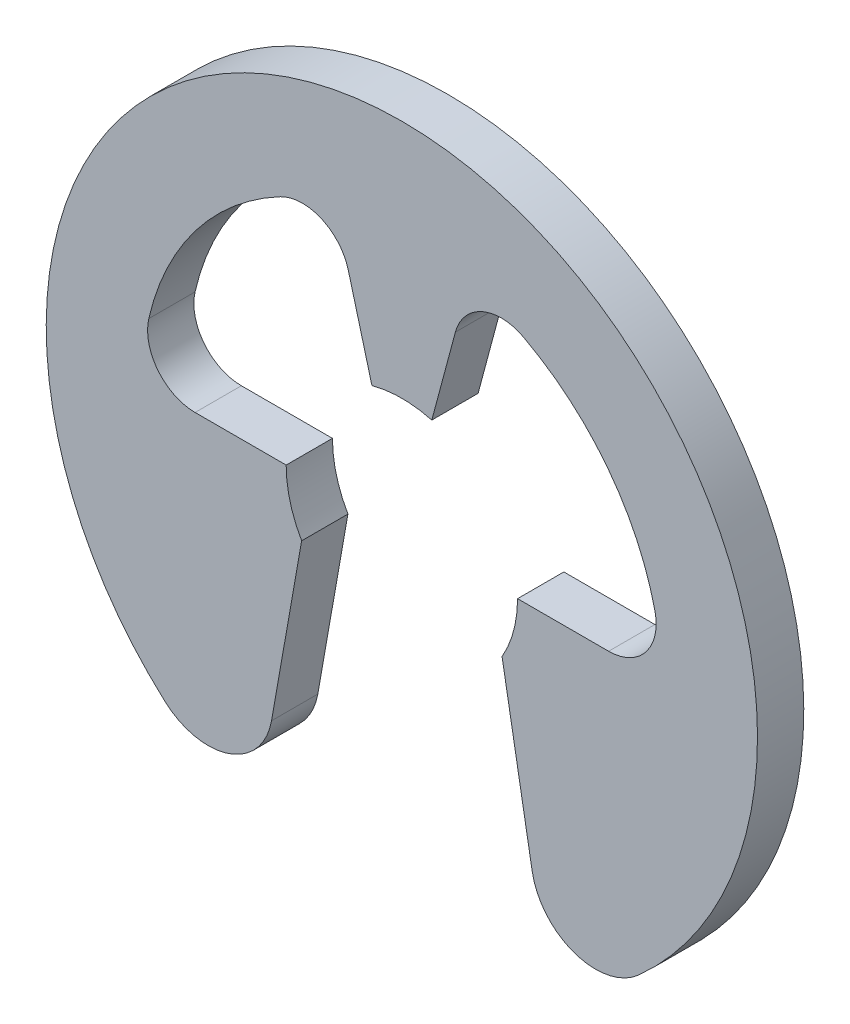
ISO-10303-21;
HEADER;
FILE_DESCRIPTION(('STEP AP214'),'2;1');
FILE_NAME('part.step','',(''),(''),'','','');
FILE_SCHEMA(('AUTOMOTIVE_DESIGN { 1 0 10303 214 1 1 1 1 }'));
ENDSEC;
DATA;
#1=APPLICATION_CONTEXT('core data for automotive mechanical design processes');
#2=APPLICATION_PROTOCOL_DEFINITION('international standard','automotive_design',2000,#1);
#3=PRODUCT_CONTEXT('',#1,'mechanical');
#4=PRODUCT('Part','Part','',(#3));
#5=PRODUCT_RELATED_PRODUCT_CATEGORY('part','',(#4));
#6=PRODUCT_DEFINITION_FORMATION('','',#4);
#7=PRODUCT_DEFINITION_CONTEXT('part definition',#1,'design');
#8=PRODUCT_DEFINITION('design','',#6,#7);
#9=PRODUCT_DEFINITION_SHAPE('','',#8);
#10=(LENGTH_UNIT() NAMED_UNIT(*) SI_UNIT(.MILLI.,.METRE.));
#11=(NAMED_UNIT(*) PLANE_ANGLE_UNIT() SI_UNIT($,.RADIAN.));
#12=(NAMED_UNIT(*) SI_UNIT($,.STERADIAN.) SOLID_ANGLE_UNIT());
#13=UNCERTAINTY_MEASURE_WITH_UNIT(LENGTH_MEASURE(1.E-05),#10,'distance_accuracy_value','');
#14=(GEOMETRIC_REPRESENTATION_CONTEXT(3) GLOBAL_UNCERTAINTY_ASSIGNED_CONTEXT((#13)) GLOBAL_UNIT_ASSIGNED_CONTEXT((#10,
#11,#12)) REPRESENTATION_CONTEXT('',''));
#15=CARTESIAN_POINT('',(0.,0.,0.));
#16=DIRECTION('',(0.,0.,1.));
#17=DIRECTION('',(1.,0.,0.));
#18=AXIS2_PLACEMENT_3D('',#15,#16,#17);
#19=CARTESIAN_POINT('',(2.83700757418314,0.651837909836066,-0.635));
#20=DIRECTION('',(0.,0.,1.));
#21=DIRECTION('',(1.,0.,0.));
#22=AXIS2_PLACEMENT_3D('',#19,#20,#21);
#23=CYLINDRICAL_SURFACE('',#22,0.651837909836066);
#24=CARTESIAN_POINT('',(2.83700757418314,0.651837909836066,0.));
#25=DIRECTION('',(0.,0.,-1.));
#26=DIRECTION('',(1.,0.,0.));
#27=AXIS2_PLACEMENT_3D('',#24,#25,#26);
#28=CIRCLE('',#27,0.651837909836066);
#29=CARTESIAN_POINT('',(3.47229253489555,0.797802561009159,0.));
#30=VERTEX_POINT('',#29);
#31=CARTESIAN_POINT('',(2.83700757418314,0.,0.));
#32=VERTEX_POINT('',#31);
#33=EDGE_CURVE('E188',#30,#32,#28,.T.);
#34=ORIENTED_EDGE('',*,*,#33,.F.);
#35=DIRECTION('',(0.,0.,1.));
#36=VECTOR('',#35,1.);
#37=CARTESIAN_POINT('',(3.47229253489555,0.797802561009159,-0.635));
#38=LINE('',#37,#36);
#39=CARTESIAN_POINT('',(3.47229253489555,0.797802561009159,-0.635));
#40=VERTEX_POINT('',#39);
#41=EDGE_CURVE('E11',#40,#30,#38,.T.);
#42=ORIENTED_EDGE('',*,*,#41,.F.);
#43=CARTESIAN_POINT('',(2.83700757418314,0.651837909836066,-0.635));
#44=DIRECTION('',(0.,0.,-1.));
#45=DIRECTION('',(1.,0.,0.));
#46=AXIS2_PLACEMENT_3D('',#43,#44,#45);
#47=CIRCLE('',#46,0.651837909836066);
#48=CARTESIAN_POINT('',(2.83700757418314,0.,-0.635));
#49=VERTEX_POINT('',#48);
#50=EDGE_CURVE('E238',#40,#49,#47,.T.);
#51=ORIENTED_EDGE('',*,*,#50,.T.);
#52=DIRECTION('',(0.,0.,1.));
#53=VECTOR('',#52,1.);
#54=CARTESIAN_POINT('',(2.83700757418314,0.,-0.635));
#55=LINE('',#54,#53);
#56=EDGE_CURVE('E34',#49,#32,#55,.T.);
#57=ORIENTED_EDGE('',*,*,#56,.T.);
#58=EDGE_LOOP('',(#34,#42,#51,#57));
#59=FACE_BOUND('',#58,.T.);
#60=ADVANCED_FACE('F31',(#59),#23,.F.);
#61=CARTESIAN_POINT('',(0.,0.,-0.635));
#62=DIRECTION('',(0.,0.,1.));
#63=DIRECTION('',(1.,0.,0.));
#64=AXIS2_PLACEMENT_3D('',#61,#62,#63);
#65=CYLINDRICAL_SURFACE('',#64,3.56276639344262);
#66=CARTESIAN_POINT('',(0.,0.,0.));
#67=DIRECTION('',(0.,0.,-1.));
#68=DIRECTION('',(1.,0.,0.));
#69=AXIS2_PLACEMENT_3D('',#66,#67,#68);
#70=CIRCLE('',#69,3.56276639344262);
#71=CARTESIAN_POINT('',(1.66931353615659,3.14749053886561,0.));
#72=VERTEX_POINT('',#71);
#73=EDGE_CURVE('E236',#72,#30,#70,.T.);
#74=ORIENTED_EDGE('',*,*,#73,.F.);
#75=DIRECTION('',(0.,0.,1.));
#76=VECTOR('',#75,1.);
#77=CARTESIAN_POINT('',(1.66931353615659,3.14749053886561,-0.635));
#78=LINE('',#77,#76);
#79=CARTESIAN_POINT('',(1.66931353615659,3.14749053886561,-0.635));
#80=VERTEX_POINT('',#79);
#81=EDGE_CURVE('E40',#80,#72,#78,.T.);
#82=ORIENTED_EDGE('',*,*,#81,.F.);
#83=CARTESIAN_POINT('',(0.,0.,-0.635));
#84=DIRECTION('',(0.,0.,-1.));
#85=DIRECTION('',(1.,0.,0.));
#86=AXIS2_PLACEMENT_3D('',#83,#84,#85);
#87=CIRCLE('',#86,3.56276639344262);
#88=EDGE_CURVE('E178',#80,#40,#87,.T.);
#89=ORIENTED_EDGE('',*,*,#88,.T.);
#90=ORIENTED_EDGE('',*,*,#41,.T.);
#91=EDGE_LOOP('',(#74,#82,#89,#90));
#92=FACE_BOUND('',#91,.T.);
#93=ADVANCED_FACE('F270',(#92),#65,.F.);
#94=CARTESIAN_POINT('',(1.36389866296364,2.5716308198958,-0.635));
#95=DIRECTION('',(0.,0.,1.));
#96=DIRECTION('',(1.,0.,0.));
#97=AXIS2_PLACEMENT_3D('',#94,#95,#96);
#98=CYLINDRICAL_SURFACE('',#97,0.651837909836066);
#99=CARTESIAN_POINT('',(1.36389866296364,2.5716308198958,0.));
#100=DIRECTION('',(0.,0.,-1.));
#101=DIRECTION('',(1.,0.,0.));
#102=AXIS2_PLACEMENT_3D('',#99,#100,#101);
#103=CIRCLE('',#102,0.651837909836066);
#104=CARTESIAN_POINT('',(0.734271591298702,2.7403388852812,0.));
#105=VERTEX_POINT('',#104);
#106=EDGE_CURVE('E165',#105,#72,#103,.T.);
#107=ORIENTED_EDGE('',*,*,#106,.F.);
#108=DIRECTION('',(0.,0.,1.));
#109=VECTOR('',#108,1.);
#110=CARTESIAN_POINT('',(0.734271591298702,2.7403388852812,-0.635));
#111=LINE('',#110,#109);
#112=CARTESIAN_POINT('',(0.734271591298702,2.7403388852812,-0.635));
#113=VERTEX_POINT('',#112);
#114=EDGE_CURVE('E160',#113,#105,#111,.T.);
#115=ORIENTED_EDGE('',*,*,#114,.F.);
#116=CARTESIAN_POINT('',(1.36389866296364,2.5716308198958,-0.635));
#117=DIRECTION('',(0.,0.,-1.));
#118=DIRECTION('',(1.,0.,0.));
#119=AXIS2_PLACEMENT_3D('',#116,#117,#118);
#120=CIRCLE('',#119,0.651837909836066);
#121=EDGE_CURVE('E163',#113,#80,#120,.T.);
#122=ORIENTED_EDGE('',*,*,#121,.T.);
#123=ORIENTED_EDGE('',*,*,#81,.T.);
#124=EDGE_LOOP('',(#107,#115,#122,#123));
#125=FACE_BOUND('',#124,.T.);
#126=ADVANCED_FACE('F162',(#125),#98,.F.);
#127=CARTESIAN_POINT('',(0.410875234100253,1.5334072492339,-0.635));
#128=DIRECTION('',(0.965925826289068,-0.258819045102522,0.));
#129=DIRECTION('',(0.258819045102522,0.965925826289068,0.));
#130=AXIS2_PLACEMENT_3D('',#127,#128,#129);
#131=PLANE('',#130);
#132=DIRECTION('',(0.258819045102522,0.965925826289068,0.));
#133=VECTOR('',#132,1.);
#134=CARTESIAN_POINT('',(0.410875234100253,1.5334072492339,0.));
#135=LINE('',#134,#133);
#136=CARTESIAN_POINT('',(0.410875234100253,1.5334072492339,0.));
#137=VERTEX_POINT('',#136);
#138=EDGE_CURVE('E233',#137,#105,#135,.T.);
#139=ORIENTED_EDGE('',*,*,#138,.F.);
#140=DIRECTION('',(0.,0.,1.));
#141=VECTOR('',#140,1.);
#142=CARTESIAN_POINT('',(0.410875234100253,1.5334072492339,-0.635));
#143=LINE('',#142,#141);
#144=CARTESIAN_POINT('',(0.410875234100253,1.5334072492339,-0.635));
#145=VERTEX_POINT('',#144);
#146=EDGE_CURVE('E170',#145,#137,#143,.T.);
#147=ORIENTED_EDGE('',*,*,#146,.F.);
#148=DIRECTION('',(0.258819045102522,0.965925826289068,0.));
#149=VECTOR('',#148,1.);
#150=CARTESIAN_POINT('',(0.410875234100253,1.5334072492339,-0.635));
#151=LINE('',#150,#149);
#152=EDGE_CURVE('E176',#145,#113,#151,.T.);
#153=ORIENTED_EDGE('',*,*,#152,.T.);
#154=ORIENTED_EDGE('',*,*,#114,.T.);
#155=EDGE_LOOP('',(#139,#147,#153,#154));
#156=FACE_BOUND('',#155,.T.);
#157=ADVANCED_FACE('F180',(#156),#131,.T.);
#158=CARTESIAN_POINT('',(0.,0.,-0.635));
#159=DIRECTION('',(0.,0.,1.));
#160=DIRECTION('',(1.,0.,0.));
#161=AXIS2_PLACEMENT_3D('',#158,#159,#160);
#162=CYLINDRICAL_SURFACE('',#161,1.5875);
#163=CARTESIAN_POINT('',(0.,0.,0.));
#164=DIRECTION('',(0.,0.,-1.));
#165=DIRECTION('',(-1.,0.,0.));
#166=AXIS2_PLACEMENT_3D('',#163,#164,#165);
#167=CIRCLE('',#166,1.5875);
#168=CARTESIAN_POINT('',(-0.410875234100253,1.5334072492339,0.));
#169=VERTEX_POINT('',#168);
#170=EDGE_CURVE('E230',#169,#137,#167,.T.);
#171=ORIENTED_EDGE('',*,*,#170,.F.);
#172=DIRECTION('',(0.,0.,1.));
#173=VECTOR('',#172,1.);
#174=CARTESIAN_POINT('',(-0.410875234100253,1.5334072492339,-0.635));
#175=LINE('',#174,#173);
#176=CARTESIAN_POINT('',(-0.410875234100253,1.5334072492339,-0.635));
#177=VERTEX_POINT('',#176);
#178=EDGE_CURVE('E242',#177,#169,#175,.T.);
#179=ORIENTED_EDGE('',*,*,#178,.F.);
#180=CARTESIAN_POINT('',(0.,0.,-0.635));
#181=DIRECTION('',(0.,0.,-1.));
#182=DIRECTION('',(-1.,0.,0.));
#183=AXIS2_PLACEMENT_3D('',#180,#181,#182);
#184=CIRCLE('',#183,1.5875);
#185=EDGE_CURVE('E181',#177,#145,#184,.T.);
#186=ORIENTED_EDGE('',*,*,#185,.T.);
#187=ORIENTED_EDGE('',*,*,#146,.T.);
#188=EDGE_LOOP('',(#171,#179,#186,#187));
#189=FACE_BOUND('',#188,.T.);
#190=ADVANCED_FACE('F283',(#189),#162,.F.);
#191=CARTESIAN_POINT('',(-0.410875234100253,1.5334072492339,-0.635));
#192=DIRECTION('',(-0.965925826289068,-0.258819045102522,0.));
#193=DIRECTION('',(0.258819045102522,-0.965925826289068,0.));
#194=AXIS2_PLACEMENT_3D('',#191,#192,#193);
#195=PLANE('',#194);
#196=DIRECTION('',(0.258819045102522,-0.965925826289068,0.));
#197=VECTOR('',#196,1.);
#198=CARTESIAN_POINT('',(-0.410875234100253,1.5334072492339,0.));
#199=LINE('',#198,#197);
#200=CARTESIAN_POINT('',(-0.734271591298703,2.7403388852812,0.));
#201=VERTEX_POINT('',#200);
#202=EDGE_CURVE('E227',#201,#169,#199,.T.);
#203=ORIENTED_EDGE('',*,*,#202,.F.);
#204=DIRECTION('',(0.,0.,1.));
#205=VECTOR('',#204,1.);
#206=CARTESIAN_POINT('',(-0.734271591298703,2.7403388852812,-0.635));
#207=LINE('',#206,#205);
#208=CARTESIAN_POINT('',(-0.734271591298703,2.7403388852812,-0.635));
#209=VERTEX_POINT('',#208);
#210=EDGE_CURVE('E244',#209,#201,#207,.T.);
#211=ORIENTED_EDGE('',*,*,#210,.F.);
#212=DIRECTION('',(0.258819045102522,-0.965925826289068,0.));
#213=VECTOR('',#212,1.);
#214=CARTESIAN_POINT('',(-0.410875234100253,1.5334072492339,-0.635));
#215=LINE('',#214,#213);
#216=EDGE_CURVE('E183',#209,#177,#215,.T.);
#217=ORIENTED_EDGE('',*,*,#216,.T.);
#218=ORIENTED_EDGE('',*,*,#178,.T.);
#219=EDGE_LOOP('',(#203,#211,#217,#218));
#220=FACE_BOUND('',#219,.T.);
#221=ADVANCED_FACE('F286',(#220),#195,.T.);
#222=CARTESIAN_POINT('',(-1.36389866296364,2.5716308198958,-0.635));
#223=DIRECTION('',(0.,0.,1.));
#224=DIRECTION('',(1.,0.,0.));
#225=AXIS2_PLACEMENT_3D('',#222,#223,#224);
#226=CYLINDRICAL_SURFACE('',#225,0.651837909836066);
#227=CARTESIAN_POINT('',(-1.36389866296364,2.5716308198958,0.));
#228=DIRECTION('',(0.,0.,-1.));
#229=DIRECTION('',(1.,0.,0.));
#230=AXIS2_PLACEMENT_3D('',#227,#228,#229);
#231=CIRCLE('',#230,0.651837909836066);
#232=CARTESIAN_POINT('',(-1.66931353615659,3.14749053886561,0.));
#233=VERTEX_POINT('',#232);
#234=EDGE_CURVE('E224',#233,#201,#231,.T.);
#235=ORIENTED_EDGE('',*,*,#234,.F.);
#236=DIRECTION('',(0.,0.,1.));
#237=VECTOR('',#236,1.);
#238=CARTESIAN_POINT('',(-1.66931353615659,3.14749053886561,-0.635));
#239=LINE('',#238,#237);
#240=CARTESIAN_POINT('',(-1.66931353615659,3.14749053886561,-0.635));
#241=VERTEX_POINT('',#240);
#242=EDGE_CURVE('E246',#241,#233,#239,.T.);
#243=ORIENTED_EDGE('',*,*,#242,.F.);
#244=CARTESIAN_POINT('',(-1.36389866296364,2.5716308198958,-0.635));
#245=DIRECTION('',(0.,0.,-1.));
#246=DIRECTION('',(1.,0.,0.));
#247=AXIS2_PLACEMENT_3D('',#244,#245,#246);
#248=CIRCLE('',#247,0.651837909836066);
#249=EDGE_CURVE('E494',#241,#209,#248,.T.);
#250=ORIENTED_EDGE('',*,*,#249,.T.);
#251=ORIENTED_EDGE('',*,*,#210,.T.);
#252=EDGE_LOOP('',(#235,#243,#250,#251));
#253=FACE_BOUND('',#252,.T.);
#254=ADVANCED_FACE('F290',(#253),#226,.F.);
#255=CARTESIAN_POINT('',(0.,0.,-0.635));
#256=DIRECTION('',(0.,0.,1.));
#257=DIRECTION('',(1.,0.,0.));
#258=AXIS2_PLACEMENT_3D('',#255,#256,#257);
#259=CYLINDRICAL_SURFACE('',#258,3.56276639344262);
#260=CARTESIAN_POINT('',(0.,0.,0.));
#261=DIRECTION('',(0.,0.,-1.));
#262=DIRECTION('',(1.,0.,0.));
#263=AXIS2_PLACEMENT_3D('',#260,#261,#262);
#264=CIRCLE('',#263,3.56276639344262);
#265=CARTESIAN_POINT('',(-3.47229253489555,0.797802561009159,0.));
#266=VERTEX_POINT('',#265);
#267=EDGE_CURVE('E221',#266,#233,#264,.T.);
#268=ORIENTED_EDGE('',*,*,#267,.F.);
#269=DIRECTION('',(0.,0.,1.));
#270=VECTOR('',#269,1.);
#271=CARTESIAN_POINT('',(-3.47229253489555,0.797802561009159,-0.635));
#272=LINE('',#271,#270);
#273=CARTESIAN_POINT('',(-3.47229253489555,0.797802561009159,-0.635));
#274=VERTEX_POINT('',#273);
#275=EDGE_CURVE('E248',#274,#266,#272,.T.);
#276=ORIENTED_EDGE('',*,*,#275,.F.);
#277=CARTESIAN_POINT('',(0.,0.,-0.635));
#278=DIRECTION('',(0.,0.,-1.));
#279=DIRECTION('',(1.,0.,0.));
#280=AXIS2_PLACEMENT_3D('',#277,#278,#279);
#281=CIRCLE('',#280,3.56276639344262);
#282=EDGE_CURVE('E498',#274,#241,#281,.T.);
#283=ORIENTED_EDGE('',*,*,#282,.T.);
#284=ORIENTED_EDGE('',*,*,#242,.T.);
#285=EDGE_LOOP('',(#268,#276,#283,#284));
#286=FACE_BOUND('',#285,.T.);
#287=ADVANCED_FACE('F294',(#286),#259,.F.);
#288=CARTESIAN_POINT('',(-2.83700757418314,0.651837909836066,-0.635));
#289=DIRECTION('',(0.,0.,1.));
#290=DIRECTION('',(1.,0.,0.));
#291=AXIS2_PLACEMENT_3D('',#288,#289,#290);
#292=CYLINDRICAL_SURFACE('',#291,0.651837909836066);
#293=CARTESIAN_POINT('',(-2.83700757418314,0.651837909836066,0.));
#294=DIRECTION('',(0.,0.,-1.));
#295=DIRECTION('',(1.,0.,0.));
#296=AXIS2_PLACEMENT_3D('',#293,#294,#295);
#297=CIRCLE('',#296,0.651837909836066);
#298=CARTESIAN_POINT('',(-2.83700757418314,0.,0.));
#299=VERTEX_POINT('',#298);
#300=EDGE_CURVE('E218',#299,#266,#297,.T.);
#301=ORIENTED_EDGE('',*,*,#300,.F.);
#302=DIRECTION('',(0.,0.,1.));
#303=VECTOR('',#302,1.);
#304=CARTESIAN_POINT('',(-2.83700757418314,0.,-0.635));
#305=LINE('',#304,#303);
#306=CARTESIAN_POINT('',(-2.83700757418314,0.,-0.635));
#307=VERTEX_POINT('',#306);
#308=EDGE_CURVE('E250',#307,#299,#305,.T.);
#309=ORIENTED_EDGE('',*,*,#308,.F.);
#310=CARTESIAN_POINT('',(-2.83700757418314,0.651837909836066,-0.635));
#311=DIRECTION('',(0.,0.,-1.));
#312=DIRECTION('',(1.,0.,0.));
#313=AXIS2_PLACEMENT_3D('',#310,#311,#312);
#314=CIRCLE('',#313,0.651837909836066);
#315=EDGE_CURVE('E487',#307,#274,#314,.T.);
#316=ORIENTED_EDGE('',*,*,#315,.T.);
#317=ORIENTED_EDGE('',*,*,#275,.T.);
#318=EDGE_LOOP('',(#301,#309,#316,#317));
#319=FACE_BOUND('',#318,.T.);
#320=ADVANCED_FACE('F298',(#319),#292,.F.);
#321=CARTESIAN_POINT('',(-1.5875,0.,-0.635));
#322=DIRECTION('',(0.,1.,0.));
#323=DIRECTION('',(-1.,0.,0.));
#324=AXIS2_PLACEMENT_3D('',#321,#322,#323);
#325=PLANE('',#324);
#326=DIRECTION('',(-1.,0.,0.));
#327=VECTOR('',#326,1.);
#328=CARTESIAN_POINT('',(-1.5875,0.,0.));
#329=LINE('',#328,#327);
#330=CARTESIAN_POINT('',(-1.5875,0.,0.));
#331=VERTEX_POINT('',#330);
#332=EDGE_CURVE('E215',#331,#299,#329,.T.);
#333=ORIENTED_EDGE('',*,*,#332,.F.);
#334=DIRECTION('',(0.,0.,1.));
#335=VECTOR('',#334,1.);
#336=CARTESIAN_POINT('',(-1.5875,0.,-0.635));
#337=LINE('',#336,#335);
#338=CARTESIAN_POINT('',(-1.5875,0.,-0.635));
#339=VERTEX_POINT('',#338);
#340=EDGE_CURVE('E252',#339,#331,#337,.T.);
#341=ORIENTED_EDGE('',*,*,#340,.F.);
#342=DIRECTION('',(-1.,0.,0.));
#343=VECTOR('',#342,1.);
#344=CARTESIAN_POINT('',(-1.5875,0.,-0.635));
#345=LINE('',#344,#343);
#346=EDGE_CURVE('E483',#339,#307,#345,.T.);
#347=ORIENTED_EDGE('',*,*,#346,.T.);
#348=ORIENTED_EDGE('',*,*,#308,.T.);
#349=EDGE_LOOP('',(#333,#341,#347,#348));
#350=FACE_BOUND('',#349,.T.);
#351=ADVANCED_FACE('F302',(#350),#325,.T.);
#352=CARTESIAN_POINT('',(0.,0.,-0.635));
#353=DIRECTION('',(0.,0.,1.));
#354=DIRECTION('',(1.,0.,0.));
#355=AXIS2_PLACEMENT_3D('',#352,#353,#354);
#356=CYLINDRICAL_SURFACE('',#355,1.5875);
#357=CARTESIAN_POINT('',(0.,0.,0.));
#358=DIRECTION('',(0.,0.,-1.));
#359=DIRECTION('',(1.,0.,0.));
#360=AXIS2_PLACEMENT_3D('',#357,#358,#359);
#361=CIRCLE('',#360,1.5875);
#362=CARTESIAN_POINT('',(-1.3748153285078,-0.793750000000001,0.));
#363=VERTEX_POINT('',#362);
#364=EDGE_CURVE('E212',#363,#331,#361,.T.);
#365=ORIENTED_EDGE('',*,*,#364,.F.);
#366=DIRECTION('',(0.,0.,1.));
#367=VECTOR('',#366,1.);
#368=CARTESIAN_POINT('',(-1.3748153285078,-0.793750000000001,-0.635));
#369=LINE('',#368,#367);
#370=CARTESIAN_POINT('',(-1.3748153285078,-0.793750000000001,-0.635));
#371=VERTEX_POINT('',#370);
#372=EDGE_CURVE('E254',#371,#363,#369,.T.);
#373=ORIENTED_EDGE('',*,*,#372,.F.);
#374=CARTESIAN_POINT('',(0.,0.,-0.635));
#375=DIRECTION('',(0.,0.,-1.));
#376=DIRECTION('',(1.,0.,0.));
#377=AXIS2_PLACEMENT_3D('',#374,#375,#376);
#378=CIRCLE('',#377,1.5875);
#379=EDGE_CURVE('E504',#371,#339,#378,.T.);
#380=ORIENTED_EDGE('',*,*,#379,.T.);
#381=ORIENTED_EDGE('',*,*,#340,.T.);
#382=EDGE_LOOP('',(#365,#373,#380,#381));
#383=FACE_BOUND('',#382,.T.);
#384=ADVANCED_FACE('F306',(#383),#356,.F.);
#385=CARTESIAN_POINT('',(-1.3748153285078,-0.793750000000001,-0.635));
#386=DIRECTION('',(0.984807753012208,-0.17364817766693,0.));
#387=DIRECTION('',(0.17364817766693,0.984807753012208,0.));
#388=AXIS2_PLACEMENT_3D('',#385,#386,#387);
#389=PLANE('',#388);
#390=DIRECTION('',(0.17364817766693,0.984807753012208,0.));
#391=VECTOR('',#390,1.);
#392=CARTESIAN_POINT('',(-1.3748153285078,-0.793750000000001,0.));
#393=LINE('',#392,#391);
#394=CARTESIAN_POINT('',(-1.78841735288215,-3.13940364139137,0.));
#395=VERTEX_POINT('',#394);
#396=EDGE_CURVE('E209',#395,#363,#393,.T.);
#397=ORIENTED_EDGE('',*,*,#396,.F.);
#398=DIRECTION('',(0.,0.,1.));
#399=VECTOR('',#398,1.);
#400=CARTESIAN_POINT('',(-1.78841735288215,-3.13940364139137,-0.635));
#401=LINE('',#400,#399);
#402=CARTESIAN_POINT('',(-1.78841735288215,-3.13940364139137,-0.635));
#403=VERTEX_POINT('',#402);
#404=EDGE_CURVE('E256',#403,#395,#401,.T.);
#405=ORIENTED_EDGE('',*,*,#404,.F.);
#406=DIRECTION('',(0.17364817766693,0.984807753012208,0.));
#407=VECTOR('',#406,1.);
#408=CARTESIAN_POINT('',(-1.3748153285078,-0.793750000000001,-0.635));
#409=LINE('',#408,#407);
#410=EDGE_CURVE('E476',#403,#371,#409,.T.);
#411=ORIENTED_EDGE('',*,*,#410,.T.);
#412=ORIENTED_EDGE('',*,*,#372,.T.);
#413=EDGE_LOOP('',(#397,#405,#411,#412));
#414=FACE_BOUND('',#413,.T.);
#415=ADVANCED_FACE('F310',(#414),#389,.T.);
#416=CARTESIAN_POINT('',(-2.6572991070241,-2.98619634509084,-0.635));
#417=DIRECTION('',(0.,0.,1.));
#418=DIRECTION('',(1.,0.,0.));
#419=AXIS2_PLACEMENT_3D('',#416,#417,#418);
#420=CYLINDRICAL_SURFACE('',#419,0.882285655737705);
#421=CARTESIAN_POINT('',(-2.6572991070241,-2.98619634509084,0.));
#422=DIRECTION('',(0.,0.,1.));
#423=DIRECTION('',(1.,0.,0.));
#424=AXIS2_PLACEMENT_3D('',#421,#422,#423);
#425=CIRCLE('',#424,0.882285655737705);
#426=CARTESIAN_POINT('',(-3.24381556118582,-3.64530667524664,0.));
#427=VERTEX_POINT('',#426);
#428=EDGE_CURVE('E206',#427,#395,#425,.T.);
#429=ORIENTED_EDGE('',*,*,#428,.F.);
#430=DIRECTION('',(0.,0.,1.));
#431=VECTOR('',#430,1.);
#432=CARTESIAN_POINT('',(-3.24381556118582,-3.64530667524664,-0.635));
#433=LINE('',#432,#431);
#434=CARTESIAN_POINT('',(-3.24381556118582,-3.64530667524664,-0.635));
#435=VERTEX_POINT('',#434);
#436=EDGE_CURVE('E258',#435,#427,#433,.T.);
#437=ORIENTED_EDGE('',*,*,#436,.F.);
#438=CARTESIAN_POINT('',(-2.6572991070241,-2.98619634509084,-0.635));
#439=DIRECTION('',(0.,0.,1.));
#440=DIRECTION('',(1.,0.,0.));
#441=AXIS2_PLACEMENT_3D('',#438,#439,#440);
#442=CIRCLE('',#441,0.882285655737705);
#443=EDGE_CURVE('E472',#435,#403,#442,.T.);
#444=ORIENTED_EDGE('',*,*,#443,.T.);
#445=ORIENTED_EDGE('',*,*,#404,.T.);
#446=EDGE_LOOP('',(#429,#437,#444,#445));
#447=FACE_BOUND('',#446,.T.);
#448=ADVANCED_FACE('F314',(#447),#420,.T.);
#449=CARTESIAN_POINT('',(0.,0.,-0.635));
#450=DIRECTION('',(0.,0.,1.));
#451=DIRECTION('',(1.,0.,0.));
#452=AXIS2_PLACEMENT_3D('',#449,#450,#451);
#453=CYLINDRICAL_SURFACE('',#452,4.8796106557377);
#454=CARTESIAN_POINT('',(0.,0.,0.));
#455=DIRECTION('',(0.,0.,1.));
#456=DIRECTION('',(1.,0.,0.));
#457=AXIS2_PLACEMENT_3D('',#454,#455,#456);
#458=CIRCLE('',#457,4.8796106557377);
#459=CARTESIAN_POINT('',(3.24381556118582,-3.64530667524664,0.));
#460=VERTEX_POINT('',#459);
#461=EDGE_CURVE('E203',#460,#427,#458,.T.);
#462=ORIENTED_EDGE('',*,*,#461,.F.);
#463=DIRECTION('',(0.,0.,1.));
#464=VECTOR('',#463,1.);
#465=CARTESIAN_POINT('',(3.24381556118582,-3.64530667524664,-0.635));
#466=LINE('',#465,#464);
#467=CARTESIAN_POINT('',(3.24381556118582,-3.64530667524664,-0.635));
#468=VERTEX_POINT('',#467);
#469=EDGE_CURVE('E260',#468,#460,#466,.T.);
#470=ORIENTED_EDGE('',*,*,#469,.F.);
#471=CARTESIAN_POINT('',(0.,0.,-0.635));
#472=DIRECTION('',(0.,0.,1.));
#473=DIRECTION('',(1.,0.,0.));
#474=AXIS2_PLACEMENT_3D('',#471,#472,#473);
#475=CIRCLE('',#474,4.8796106557377);
#476=EDGE_CURVE('E508',#468,#435,#475,.T.);
#477=ORIENTED_EDGE('',*,*,#476,.T.);
#478=ORIENTED_EDGE('',*,*,#436,.T.);
#479=EDGE_LOOP('',(#462,#470,#477,#478));
#480=FACE_BOUND('',#479,.T.);
#481=ADVANCED_FACE('F318',(#480),#453,.T.);
#482=CARTESIAN_POINT('',(2.6572991070241,-2.98619634509084,-0.635));
#483=DIRECTION('',(0.,0.,1.));
#484=DIRECTION('',(1.,0.,0.));
#485=AXIS2_PLACEMENT_3D('',#482,#483,#484);
#486=CYLINDRICAL_SURFACE('',#485,0.882285655737705);
#487=CARTESIAN_POINT('',(2.6572991070241,-2.98619634509084,0.));
#488=DIRECTION('',(0.,0.,1.));
#489=DIRECTION('',(1.,0.,0.));
#490=AXIS2_PLACEMENT_3D('',#487,#488,#489);
#491=CIRCLE('',#490,0.882285655737705);
#492=CARTESIAN_POINT('',(1.78841735288215,-3.13940364139137,0.));
#493=VERTEX_POINT('',#492);
#494=EDGE_CURVE('E200',#493,#460,#491,.T.);
#495=ORIENTED_EDGE('',*,*,#494,.F.);
#496=DIRECTION('',(0.,0.,1.));
#497=VECTOR('',#496,1.);
#498=CARTESIAN_POINT('',(1.78841735288215,-3.13940364139137,-0.635));
#499=LINE('',#498,#497);
#500=CARTESIAN_POINT('',(1.78841735288215,-3.13940364139137,-0.635));
#501=VERTEX_POINT('',#500);
#502=EDGE_CURVE('E262',#501,#493,#499,.T.);
#503=ORIENTED_EDGE('',*,*,#502,.F.);
#504=CARTESIAN_POINT('',(2.6572991070241,-2.98619634509084,-0.635));
#505=DIRECTION('',(0.,0.,1.));
#506=DIRECTION('',(1.,0.,0.));
#507=AXIS2_PLACEMENT_3D('',#504,#505,#506);
#508=CIRCLE('',#507,0.882285655737705);
#509=EDGE_CURVE('E465',#501,#468,#508,.T.);
#510=ORIENTED_EDGE('',*,*,#509,.T.);
#511=ORIENTED_EDGE('',*,*,#469,.T.);
#512=EDGE_LOOP('',(#495,#503,#510,#511));
#513=FACE_BOUND('',#512,.T.);
#514=ADVANCED_FACE('F322',(#513),#486,.T.);
#515=CARTESIAN_POINT('',(1.3748153285078,-0.793750000000001,-0.635));
#516=DIRECTION('',(-0.984807753012208,-0.17364817766693,0.));
#517=DIRECTION('',(0.17364817766693,-0.984807753012208,0.));
#518=AXIS2_PLACEMENT_3D('',#515,#516,#517);
#519=PLANE('',#518);
#520=DIRECTION('',(0.17364817766693,-0.984807753012208,0.));
#521=VECTOR('',#520,1.);
#522=CARTESIAN_POINT('',(1.3748153285078,-0.793750000000001,0.));
#523=LINE('',#522,#521);
#524=CARTESIAN_POINT('',(1.3748153285078,-0.793750000000001,0.));
#525=VERTEX_POINT('',#524);
#526=EDGE_CURVE('E197',#525,#493,#523,.T.);
#527=ORIENTED_EDGE('',*,*,#526,.F.);
#528=DIRECTION('',(0.,0.,1.));
#529=VECTOR('',#528,1.);
#530=CARTESIAN_POINT('',(1.3748153285078,-0.793750000000001,-0.635));
#531=LINE('',#530,#529);
#532=CARTESIAN_POINT('',(1.3748153285078,-0.793750000000001,-0.635));
#533=VERTEX_POINT('',#532);
#534=EDGE_CURVE('E264',#533,#525,#531,.T.);
#535=ORIENTED_EDGE('',*,*,#534,.F.);
#536=DIRECTION('',(0.17364817766693,-0.984807753012208,0.));
#537=VECTOR('',#536,1.);
#538=CARTESIAN_POINT('',(1.3748153285078,-0.793750000000001,-0.635));
#539=LINE('',#538,#537);
#540=EDGE_CURVE('E461',#533,#501,#539,.T.);
#541=ORIENTED_EDGE('',*,*,#540,.T.);
#542=ORIENTED_EDGE('',*,*,#502,.T.);
#543=EDGE_LOOP('',(#527,#535,#541,#542));
#544=FACE_BOUND('',#543,.T.);
#545=ADVANCED_FACE('F326',(#544),#519,.T.);
#546=CARTESIAN_POINT('',(0.,0.,-0.635));
#547=DIRECTION('',(0.,0.,1.));
#548=DIRECTION('',(1.,0.,0.));
#549=AXIS2_PLACEMENT_3D('',#546,#547,#548);
#550=CYLINDRICAL_SURFACE('',#549,1.5875);
#551=CARTESIAN_POINT('',(0.,0.,0.));
#552=DIRECTION('',(0.,0.,-1.));
#553=DIRECTION('',(1.,0.,0.));
#554=AXIS2_PLACEMENT_3D('',#551,#552,#553);
#555=CIRCLE('',#554,1.5875);
#556=CARTESIAN_POINT('',(1.5875,0.,0.));
#557=VERTEX_POINT('',#556);
#558=EDGE_CURVE('E194',#557,#525,#555,.T.);
#559=ORIENTED_EDGE('',*,*,#558,.F.);
#560=DIRECTION('',(0.,0.,1.));
#561=VECTOR('',#560,1.);
#562=CARTESIAN_POINT('',(1.5875,0.,-0.635));
#563=LINE('',#562,#561);
#564=CARTESIAN_POINT('',(1.5875,0.,-0.635));
#565=VERTEX_POINT('',#564);
#566=EDGE_CURVE('E265',#565,#557,#563,.T.);
#567=ORIENTED_EDGE('',*,*,#566,.F.);
#568=CARTESIAN_POINT('',(0.,0.,-0.635));
#569=DIRECTION('',(0.,0.,-1.));
#570=DIRECTION('',(1.,0.,0.));
#571=AXIS2_PLACEMENT_3D('',#568,#569,#570);
#572=CIRCLE('',#571,1.5875);
#573=EDGE_CURVE('E512',#565,#533,#572,.T.);
#574=ORIENTED_EDGE('',*,*,#573,.T.);
#575=ORIENTED_EDGE('',*,*,#534,.T.);
#576=EDGE_LOOP('',(#559,#567,#574,#575));
#577=FACE_BOUND('',#576,.T.);
#578=ADVANCED_FACE('F330',(#577),#550,.F.);
#579=CARTESIAN_POINT('',(1.5875,0.,-0.635));
#580=DIRECTION('',(0.,1.,0.));
#581=DIRECTION('',(0.,0.,1.));
#582=AXIS2_PLACEMENT_3D('',#579,#580,#581);
#583=PLANE('',#582);
#584=DIRECTION('',(-1.,0.,0.));
#585=VECTOR('',#584,1.);
#586=CARTESIAN_POINT('',(1.5875,0.,0.));
#587=LINE('',#586,#585);
#588=EDGE_CURVE('E191',#32,#557,#587,.T.);
#589=ORIENTED_EDGE('',*,*,#588,.F.);
#590=ORIENTED_EDGE('',*,*,#56,.F.);
#591=DIRECTION('',(-1.,0.,0.));
#592=VECTOR('',#591,1.);
#593=CARTESIAN_POINT('',(1.5875,0.,-0.635));
#594=LINE('',#593,#592);
#595=EDGE_CURVE('E514',#49,#565,#594,.T.);
#596=ORIENTED_EDGE('',*,*,#595,.T.);
#597=ORIENTED_EDGE('',*,*,#566,.T.);
#598=EDGE_LOOP('',(#589,#590,#596,#597));
#599=FACE_BOUND('',#598,.T.);
#600=ADVANCED_FACE('F267',(#599),#583,.T.);
#601=CARTESIAN_POINT('',(2.83700757418314,0.651837909836066,-0.635));
#602=DIRECTION('',(0.,0.,1.));
#603=DIRECTION('',(1.,0.,0.));
#604=AXIS2_PLACEMENT_3D('',#601,#602,#603);
#605=PLANE('',#604);
#606=ORIENTED_EDGE('',*,*,#50,.F.);
#607=ORIENTED_EDGE('',*,*,#88,.F.);
#608=ORIENTED_EDGE('',*,*,#121,.F.);
#609=ORIENTED_EDGE('',*,*,#152,.F.);
#610=ORIENTED_EDGE('',*,*,#185,.F.);
#611=ORIENTED_EDGE('',*,*,#216,.F.);
#612=ORIENTED_EDGE('',*,*,#249,.F.);
#613=ORIENTED_EDGE('',*,*,#282,.F.);
#614=ORIENTED_EDGE('',*,*,#315,.F.);
#615=ORIENTED_EDGE('',*,*,#346,.F.);
#616=ORIENTED_EDGE('',*,*,#379,.F.);
#617=ORIENTED_EDGE('',*,*,#410,.F.);
#618=ORIENTED_EDGE('',*,*,#443,.F.);
#619=ORIENTED_EDGE('',*,*,#476,.F.);
#620=ORIENTED_EDGE('',*,*,#509,.F.);
#621=ORIENTED_EDGE('',*,*,#540,.F.);
#622=ORIENTED_EDGE('',*,*,#573,.F.);
#623=ORIENTED_EDGE('',*,*,#595,.F.);
#624=EDGE_LOOP('',(#606,#607,#608,#609,#610,#611,#612,#613,#614,#615,#616,#617,#618,#619,#620,
#621,#622,#623));
#625=FACE_BOUND('',#624,.T.);
#626=ADVANCED_FACE('F174',(#625),#605,.F.);
#627=CARTESIAN_POINT('',(2.83700757418314,0.651837909836066,0.));
#628=DIRECTION('',(0.,0.,1.));
#629=DIRECTION('',(1.,0.,0.));
#630=AXIS2_PLACEMENT_3D('',#627,#628,#629);
#631=PLANE('',#630);
#632=ORIENTED_EDGE('',*,*,#33,.T.);
#633=ORIENTED_EDGE('',*,*,#588,.T.);
#634=ORIENTED_EDGE('',*,*,#558,.T.);
#635=ORIENTED_EDGE('',*,*,#526,.T.);
#636=ORIENTED_EDGE('',*,*,#494,.T.);
#637=ORIENTED_EDGE('',*,*,#461,.T.);
#638=ORIENTED_EDGE('',*,*,#428,.T.);
#639=ORIENTED_EDGE('',*,*,#396,.T.);
#640=ORIENTED_EDGE('',*,*,#364,.T.);
#641=ORIENTED_EDGE('',*,*,#332,.T.);
#642=ORIENTED_EDGE('',*,*,#300,.T.);
#643=ORIENTED_EDGE('',*,*,#267,.T.);
#644=ORIENTED_EDGE('',*,*,#234,.T.);
#645=ORIENTED_EDGE('',*,*,#202,.T.);
#646=ORIENTED_EDGE('',*,*,#170,.T.);
#647=ORIENTED_EDGE('',*,*,#138,.T.);
#648=ORIENTED_EDGE('',*,*,#106,.T.);
#649=ORIENTED_EDGE('',*,*,#73,.T.);
#650=EDGE_LOOP('',(#632,#633,#634,#635,#636,#637,#638,#639,#640,#641,#642,#643,#644,#645,#646,
#647,#648,#649));
#651=FACE_BOUND('',#650,.T.);
#652=ADVANCED_FACE('F269',(#651),#631,.T.);
#653=CLOSED_SHELL('',(#60,#93,#126,#157,#190,#221,#254,#287,#320,#351,#384,#415,#448,#481,#514,
#545,#578,#600,#626,#652));
#654=MANIFOLD_SOLID_BREP('B2',#653);
#655=ADVANCED_BREP_SHAPE_REPRESENTATION('',(#18,#654),#14);
#656=SHAPE_DEFINITION_REPRESENTATION(#9,#655);
ENDSEC;
END-ISO-10303-21;
